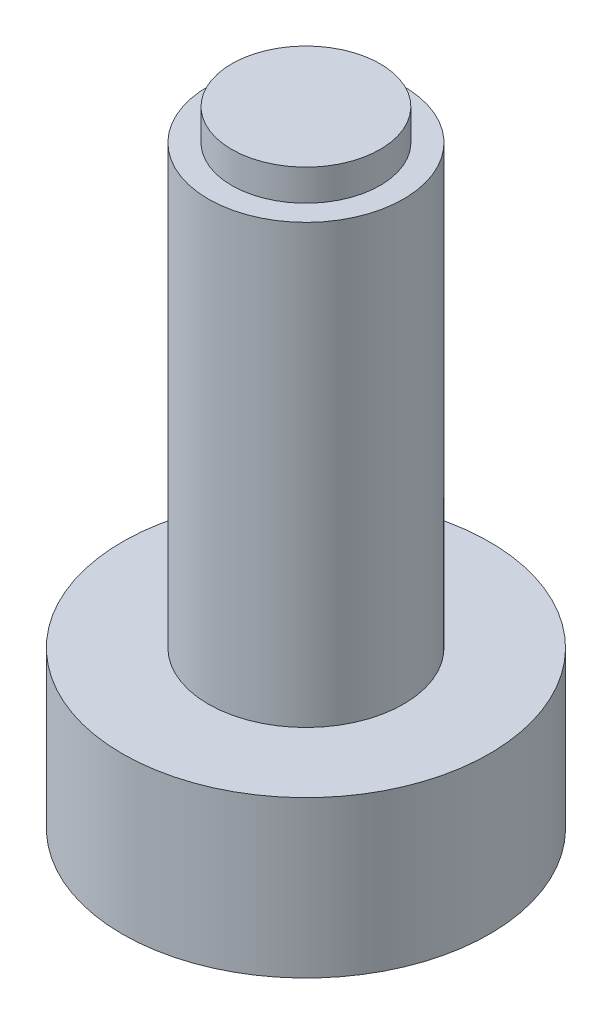
ISO-10303-21;
HEADER;
FILE_DESCRIPTION(('STEP AP214'),'2;1');
FILE_NAME('part.step','',(''),(''),'','','');
FILE_SCHEMA(('AUTOMOTIVE_DESIGN { 1 0 10303 214 1 1 1 1 }'));
ENDSEC;
DATA;
#1=APPLICATION_CONTEXT('core data for automotive mechanical design processes');
#2=APPLICATION_PROTOCOL_DEFINITION('international standard','automotive_design',2000,#1);
#3=PRODUCT_CONTEXT('',#1,'mechanical');
#4=PRODUCT('Part','Part','',(#3));
#5=PRODUCT_RELATED_PRODUCT_CATEGORY('part','',(#4));
#6=PRODUCT_DEFINITION_FORMATION('','',#4);
#7=PRODUCT_DEFINITION_CONTEXT('part definition',#1,'design');
#8=PRODUCT_DEFINITION('design','',#6,#7);
#9=PRODUCT_DEFINITION_SHAPE('','',#8);
#10=(LENGTH_UNIT() NAMED_UNIT(*) SI_UNIT(.MILLI.,.METRE.));
#11=(NAMED_UNIT(*) PLANE_ANGLE_UNIT() SI_UNIT($,.RADIAN.));
#12=(NAMED_UNIT(*) SI_UNIT($,.STERADIAN.) SOLID_ANGLE_UNIT());
#13=UNCERTAINTY_MEASURE_WITH_UNIT(LENGTH_MEASURE(1.E-05),#10,'distance_accuracy_value','');
#14=(GEOMETRIC_REPRESENTATION_CONTEXT(3) GLOBAL_UNCERTAINTY_ASSIGNED_CONTEXT((#13)) GLOBAL_UNIT_ASSIGNED_CONTEXT((#10,
#11,#12)) REPRESENTATION_CONTEXT('',''));
#15=CARTESIAN_POINT('',(0.,0.,0.));
#16=DIRECTION('',(0.,0.,1.));
#17=DIRECTION('',(1.,0.,0.));
#18=AXIS2_PLACEMENT_3D('',#15,#16,#17);
#19=CARTESIAN_POINT('',(0.,0.,0.));
#20=DIRECTION('',(0.,-1.,0.));
#21=DIRECTION('',(0.,0.,-1.));
#22=AXIS2_PLACEMENT_3D('',#19,#20,#21);
#23=CYLINDRICAL_SURFACE('',#22,4.7);
#24=CARTESIAN_POINT('',(0.,0.,0.));
#25=DIRECTION('',(0.,1.,0.));
#26=DIRECTION('',(0.,0.,1.));
#27=AXIS2_PLACEMENT_3D('',#24,#25,#26);
#28=CIRCLE('',#27,4.7);
#29=CARTESIAN_POINT('',(0.,0.,4.7));
#30=VERTEX_POINT('',#29);
#31=EDGE_CURVE('E153',#30,#30,#28,.T.);
#32=ORIENTED_EDGE('',*,*,#31,.F.);
#33=EDGE_LOOP('',(#32));
#34=FACE_BOUND('',#33,.T.);
#35=CARTESIAN_POINT('',(0.,-4.,0.));
#36=DIRECTION('',(0.,1.,0.));
#37=DIRECTION('',(0.,0.,1.));
#38=AXIS2_PLACEMENT_3D('',#35,#36,#37);
#39=CIRCLE('',#38,4.7);
#40=CARTESIAN_POINT('',(0.,-4.,4.7));
#41=VERTEX_POINT('',#40);
#42=EDGE_CURVE('E40',#41,#41,#39,.T.);
#43=ORIENTED_EDGE('',*,*,#42,.T.);
#44=EDGE_LOOP('',(#43));
#45=FACE_BOUND('',#44,.T.);
#46=ADVANCED_FACE('F37',(#34,#45),#23,.T.);
#47=CARTESIAN_POINT('',(0.,0.,0.));
#48=DIRECTION('',(0.,1.,0.));
#49=DIRECTION('',(0.,0.,1.));
#50=AXIS2_PLACEMENT_3D('',#47,#48,#49);
#51=PLANE('',#50);
#52=CARTESIAN_POINT('',(0.,0.,0.));
#53=DIRECTION('',(0.,1.,0.));
#54=DIRECTION('',(0.,0.,1.));
#55=AXIS2_PLACEMENT_3D('',#52,#53,#54);
#56=CIRCLE('',#55,2.5);
#57=CARTESIAN_POINT('',(0.,0.,2.5));
#58=VERTEX_POINT('',#57);
#59=EDGE_CURVE('E45',#58,#58,#56,.T.);
#60=ORIENTED_EDGE('',*,*,#59,.F.);
#61=EDGE_LOOP('',(#60));
#62=FACE_BOUND('',#61,.T.);
#63=ORIENTED_EDGE('',*,*,#31,.T.);
#64=EDGE_LOOP('',(#63));
#65=FACE_BOUND('',#64,.T.);
#66=ADVANCED_FACE('F162',(#62,#65),#51,.T.);
#67=CARTESIAN_POINT('',(0.,-4.,0.));
#68=DIRECTION('',(0.,1.,0.));
#69=DIRECTION('',(0.,0.,1.));
#70=AXIS2_PLACEMENT_3D('',#67,#68,#69);
#71=PLANE('',#70);
#72=DIRECTION('',(0.5,0.,-0.866025403784439));
#73=VECTOR('',#72,1.);
#74=CARTESIAN_POINT('',(1.73205080756888,-4.,0.));
#75=LINE('',#74,#73);
#76=CARTESIAN_POINT('',(0.866025403784439,-4.,1.5));
#77=VERTEX_POINT('',#76);
#78=CARTESIAN_POINT('',(1.73205080756888,-4.,0.));
#79=VERTEX_POINT('',#78);
#80=EDGE_CURVE('E115',#77,#79,#75,.T.);
#81=ORIENTED_EDGE('',*,*,#80,.T.);
#82=DIRECTION('',(-0.5,0.,-0.866025403784439));
#83=VECTOR('',#82,1.);
#84=CARTESIAN_POINT('',(0.866025403784439,-4.,-1.5));
#85=LINE('',#84,#83);
#86=CARTESIAN_POINT('',(0.866025403784439,-4.,-1.5));
#87=VERTEX_POINT('',#86);
#88=EDGE_CURVE('E139',#79,#87,#85,.T.);
#89=ORIENTED_EDGE('',*,*,#88,.T.);
#90=DIRECTION('',(-1.,0.,0.));
#91=VECTOR('',#90,1.);
#92=CARTESIAN_POINT('',(-0.866025403784439,-4.,-1.5));
#93=LINE('',#92,#91);
#94=CARTESIAN_POINT('',(-0.866025403784439,-4.,-1.5));
#95=VERTEX_POINT('',#94);
#96=EDGE_CURVE('E121',#87,#95,#93,.T.);
#97=ORIENTED_EDGE('',*,*,#96,.T.);
#98=DIRECTION('',(-0.5,0.,0.866025403784439));
#99=VECTOR('',#98,1.);
#100=CARTESIAN_POINT('',(-1.73205080756888,-4.,0.));
#101=LINE('',#100,#99);
#102=CARTESIAN_POINT('',(-1.73205080756888,-4.,0.));
#103=VERTEX_POINT('',#102);
#104=EDGE_CURVE('E53',#95,#103,#101,.T.);
#105=ORIENTED_EDGE('',*,*,#104,.T.);
#106=DIRECTION('',(0.5,0.,0.866025403784439));
#107=VECTOR('',#106,1.);
#108=CARTESIAN_POINT('',(-0.866025403784438,-4.,1.5));
#109=LINE('',#108,#107);
#110=CARTESIAN_POINT('',(-0.866025403784438,-4.,1.5));
#111=VERTEX_POINT('',#110);
#112=EDGE_CURVE('E101',#103,#111,#109,.T.);
#113=ORIENTED_EDGE('',*,*,#112,.T.);
#114=DIRECTION('',(1.,0.,0.));
#115=VECTOR('',#114,1.);
#116=CARTESIAN_POINT('',(0.866025403784439,-4.,1.5));
#117=LINE('',#116,#115);
#118=EDGE_CURVE('E111',#111,#77,#117,.T.);
#119=ORIENTED_EDGE('',*,*,#118,.T.);
#120=EDGE_LOOP('',(#81,#89,#97,#105,#113,#119));
#121=FACE_BOUND('',#120,.T.);
#122=ORIENTED_EDGE('',*,*,#42,.F.);
#123=EDGE_LOOP('',(#122));
#124=FACE_BOUND('',#123,.T.);
#125=ADVANCED_FACE('F117',(#121,#124),#71,.F.);
#126=CARTESIAN_POINT('',(0.,11.2,0.));
#127=DIRECTION('',(0.,-1.,0.));
#128=DIRECTION('',(0.,0.,-1.));
#129=AXIS2_PLACEMENT_3D('',#126,#127,#128);
#130=CYLINDRICAL_SURFACE('',#129,2.5);
#131=CARTESIAN_POINT('',(0.,11.2,0.));
#132=DIRECTION('',(0.,1.,0.));
#133=DIRECTION('',(0.,0.,1.));
#134=AXIS2_PLACEMENT_3D('',#131,#132,#133);
#135=CIRCLE('',#134,2.5);
#136=CARTESIAN_POINT('',(0.,11.2,2.5));
#137=VERTEX_POINT('',#136);
#138=EDGE_CURVE('E148',#137,#137,#135,.T.);
#139=ORIENTED_EDGE('',*,*,#138,.F.);
#140=EDGE_LOOP('',(#139));
#141=FACE_BOUND('',#140,.T.);
#142=ORIENTED_EDGE('',*,*,#59,.T.);
#143=EDGE_LOOP('',(#142));
#144=FACE_BOUND('',#143,.T.);
#145=ADVANCED_FACE('F161',(#141,#144),#130,.T.);
#146=CARTESIAN_POINT('',(0.,11.2,0.));
#147=DIRECTION('',(0.,1.,0.));
#148=DIRECTION('',(0.,0.,1.));
#149=AXIS2_PLACEMENT_3D('',#146,#147,#148);
#150=PLANE('',#149);
#151=CARTESIAN_POINT('',(0.,11.2,0.));
#152=DIRECTION('',(0.,1.,0.));
#153=DIRECTION('',(0.,0.,1.));
#154=AXIS2_PLACEMENT_3D('',#151,#152,#153);
#155=CIRCLE('',#154,1.9);
#156=CARTESIAN_POINT('',(0.,11.2,1.9));
#157=VERTEX_POINT('',#156);
#158=EDGE_CURVE('E11',#157,#157,#155,.T.);
#159=ORIENTED_EDGE('',*,*,#158,.F.);
#160=EDGE_LOOP('',(#159));
#161=FACE_BOUND('',#160,.T.);
#162=ORIENTED_EDGE('',*,*,#138,.T.);
#163=EDGE_LOOP('',(#162));
#164=FACE_BOUND('',#163,.T.);
#165=ADVANCED_FACE('F167',(#161,#164),#150,.T.);
#166=CARTESIAN_POINT('',(0.,12.,0.));
#167=DIRECTION('',(0.,-1.,0.));
#168=DIRECTION('',(0.,0.,-1.));
#169=AXIS2_PLACEMENT_3D('',#166,#167,#168);
#170=CYLINDRICAL_SURFACE('',#169,1.9);
#171=CARTESIAN_POINT('',(0.,12.,0.));
#172=DIRECTION('',(0.,1.,0.));
#173=DIRECTION('',(0.,0.,1.));
#174=AXIS2_PLACEMENT_3D('',#171,#172,#173);
#175=CIRCLE('',#174,1.9);
#176=CARTESIAN_POINT('',(0.,12.,1.9));
#177=VERTEX_POINT('',#176);
#178=EDGE_CURVE('E141',#177,#177,#175,.T.);
#179=ORIENTED_EDGE('',*,*,#178,.F.);
#180=EDGE_LOOP('',(#179));
#181=FACE_BOUND('',#180,.T.);
#182=ORIENTED_EDGE('',*,*,#158,.T.);
#183=EDGE_LOOP('',(#182));
#184=FACE_BOUND('',#183,.T.);
#185=ADVANCED_FACE('F198',(#181,#184),#170,.T.);
#186=CARTESIAN_POINT('',(0.,12.,0.));
#187=DIRECTION('',(0.,1.,0.));
#188=DIRECTION('',(0.,0.,1.));
#189=AXIS2_PLACEMENT_3D('',#186,#187,#188);
#190=PLANE('',#189);
#191=ORIENTED_EDGE('',*,*,#178,.T.);
#192=EDGE_LOOP('',(#191));
#193=FACE_BOUND('',#192,.T.);
#194=ADVANCED_FACE('F209',(#193),#190,.T.);
#195=CARTESIAN_POINT('',(0.866025403784439,-4.,-1.5));
#196=DIRECTION('',(0.866025403784439,0.,-0.5));
#197=DIRECTION('',(-0.5,0.,-0.866025403784439));
#198=AXIS2_PLACEMENT_3D('',#195,#196,#197);
#199=PLANE('',#198);
#200=DIRECTION('',(-0.5,0.,-0.866025403784439));
#201=VECTOR('',#200,1.);
#202=CARTESIAN_POINT('',(0.866025403784439,-1.5,-1.5));
#203=LINE('',#202,#201);
#204=CARTESIAN_POINT('',(1.73205080756888,-1.5,0.));
#205=VERTEX_POINT('',#204);
#206=CARTESIAN_POINT('',(0.866025403784439,-1.5,-1.5));
#207=VERTEX_POINT('',#206);
#208=EDGE_CURVE('E126',#205,#207,#203,.T.);
#209=ORIENTED_EDGE('',*,*,#208,.T.);
#210=DIRECTION('',(0.,1.,0.));
#211=VECTOR('',#210,1.);
#212=CARTESIAN_POINT('',(0.866025403784439,-4.,-1.5));
#213=LINE('',#212,#211);
#214=EDGE_CURVE('E90',#87,#207,#213,.T.);
#215=ORIENTED_EDGE('',*,*,#214,.F.);
#216=ORIENTED_EDGE('',*,*,#88,.F.);
#217=DIRECTION('',(0.,1.,0.));
#218=VECTOR('',#217,1.);
#219=CARTESIAN_POINT('',(1.73205080756888,-4.,0.));
#220=LINE('',#219,#218);
#221=EDGE_CURVE('E62',#79,#205,#220,.T.);
#222=ORIENTED_EDGE('',*,*,#221,.T.);
#223=EDGE_LOOP('',(#209,#215,#216,#222));
#224=FACE_BOUND('',#223,.T.);
#225=ADVANCED_FACE('F219',(#224),#199,.F.);
#226=CARTESIAN_POINT('',(1.73205080756888,-4.,0.));
#227=DIRECTION('',(0.866025403784439,0.,0.5));
#228=DIRECTION('',(0.5,0.,-0.866025403784439));
#229=AXIS2_PLACEMENT_3D('',#226,#227,#228);
#230=PLANE('',#229);
#231=DIRECTION('',(0.5,0.,-0.866025403784439));
#232=VECTOR('',#231,1.);
#233=CARTESIAN_POINT('',(1.73205080756888,-1.5,0.));
#234=LINE('',#233,#232);
#235=CARTESIAN_POINT('',(0.866025403784439,-1.5,1.5));
#236=VERTEX_POINT('',#235);
#237=EDGE_CURVE('E137',#236,#205,#234,.T.);
#238=ORIENTED_EDGE('',*,*,#237,.T.);
#239=ORIENTED_EDGE('',*,*,#221,.F.);
#240=ORIENTED_EDGE('',*,*,#80,.F.);
#241=DIRECTION('',(0.,1.,0.));
#242=VECTOR('',#241,1.);
#243=CARTESIAN_POINT('',(0.866025403784439,-4.,1.5));
#244=LINE('',#243,#242);
#245=EDGE_CURVE('E107',#77,#236,#244,.T.);
#246=ORIENTED_EDGE('',*,*,#245,.T.);
#247=EDGE_LOOP('',(#238,#239,#240,#246));
#248=FACE_BOUND('',#247,.T.);
#249=ADVANCED_FACE('F235',(#248),#230,.F.);
#250=CARTESIAN_POINT('',(0.866025403784439,-4.,1.5));
#251=DIRECTION('',(0.,0.,1.));
#252=DIRECTION('',(1.,0.,0.));
#253=AXIS2_PLACEMENT_3D('',#250,#251,#252);
#254=PLANE('',#253);
#255=DIRECTION('',(1.,0.,0.));
#256=VECTOR('',#255,1.);
#257=CARTESIAN_POINT('',(0.866025403784439,-1.5,1.5));
#258=LINE('',#257,#256);
#259=CARTESIAN_POINT('',(-0.866025403784438,-1.5,1.5));
#260=VERTEX_POINT('',#259);
#261=EDGE_CURVE('E135',#260,#236,#258,.T.);
#262=ORIENTED_EDGE('',*,*,#261,.T.);
#263=ORIENTED_EDGE('',*,*,#245,.F.);
#264=ORIENTED_EDGE('',*,*,#118,.F.);
#265=DIRECTION('',(0.,1.,0.));
#266=VECTOR('',#265,1.);
#267=CARTESIAN_POINT('',(-0.866025403784438,-4.,1.5));
#268=LINE('',#267,#266);
#269=EDGE_CURVE('E97',#111,#260,#268,.T.);
#270=ORIENTED_EDGE('',*,*,#269,.T.);
#271=EDGE_LOOP('',(#262,#263,#264,#270));
#272=FACE_BOUND('',#271,.T.);
#273=ADVANCED_FACE('F112',(#272),#254,.F.);
#274=CARTESIAN_POINT('',(-0.866025403784438,-4.,1.5));
#275=DIRECTION('',(-0.866025403784439,0.,0.5));
#276=DIRECTION('',(0.5,0.,0.866025403784439));
#277=AXIS2_PLACEMENT_3D('',#274,#275,#276);
#278=PLANE('',#277);
#279=DIRECTION('',(0.5,0.,0.866025403784439));
#280=VECTOR('',#279,1.);
#281=CARTESIAN_POINT('',(-0.866025403784438,-1.5,1.5));
#282=LINE('',#281,#280);
#283=CARTESIAN_POINT('',(-1.73205080756888,-1.5,0.));
#284=VERTEX_POINT('',#283);
#285=EDGE_CURVE('E103',#284,#260,#282,.T.);
#286=ORIENTED_EDGE('',*,*,#285,.T.);
#287=ORIENTED_EDGE('',*,*,#269,.F.);
#288=ORIENTED_EDGE('',*,*,#112,.F.);
#289=DIRECTION('',(0.,1.,0.));
#290=VECTOR('',#289,1.);
#291=CARTESIAN_POINT('',(-1.73205080756888,-4.,0.));
#292=LINE('',#291,#290);
#293=EDGE_CURVE('E108',#103,#284,#292,.T.);
#294=ORIENTED_EDGE('',*,*,#293,.T.);
#295=EDGE_LOOP('',(#286,#287,#288,#294));
#296=FACE_BOUND('',#295,.T.);
#297=ADVANCED_FACE('F99',(#296),#278,.F.);
#298=CARTESIAN_POINT('',(-1.73205080756888,-4.,0.));
#299=DIRECTION('',(-0.866025403784439,0.,-0.5));
#300=DIRECTION('',(-0.5,0.,0.866025403784439));
#301=AXIS2_PLACEMENT_3D('',#298,#299,#300);
#302=PLANE('',#301);
#303=DIRECTION('',(-0.5,0.,0.866025403784439));
#304=VECTOR('',#303,1.);
#305=CARTESIAN_POINT('',(-1.73205080756888,-1.5,0.));
#306=LINE('',#305,#304);
#307=CARTESIAN_POINT('',(-0.866025403784439,-1.5,-1.5));
#308=VERTEX_POINT('',#307);
#309=EDGE_CURVE('E131',#308,#284,#306,.T.);
#310=ORIENTED_EDGE('',*,*,#309,.T.);
#311=ORIENTED_EDGE('',*,*,#293,.F.);
#312=ORIENTED_EDGE('',*,*,#104,.F.);
#313=DIRECTION('',(0.,1.,0.));
#314=VECTOR('',#313,1.);
#315=CARTESIAN_POINT('',(-0.866025403784439,-4.,-1.5));
#316=LINE('',#315,#314);
#317=EDGE_CURVE('E144',#95,#308,#316,.T.);
#318=ORIENTED_EDGE('',*,*,#317,.T.);
#319=EDGE_LOOP('',(#310,#311,#312,#318));
#320=FACE_BOUND('',#319,.T.);
#321=ADVANCED_FACE('F263',(#320),#302,.F.);
#322=CARTESIAN_POINT('',(-0.866025403784439,-4.,-1.5));
#323=DIRECTION('',(0.,0.,-1.));
#324=DIRECTION('',(-1.,0.,0.));
#325=AXIS2_PLACEMENT_3D('',#322,#323,#324);
#326=PLANE('',#325);
#327=DIRECTION('',(-1.,0.,0.));
#328=VECTOR('',#327,1.);
#329=CARTESIAN_POINT('',(-0.866025403784439,-1.5,-1.5));
#330=LINE('',#329,#328);
#331=EDGE_CURVE('E128',#207,#308,#330,.T.);
#332=ORIENTED_EDGE('',*,*,#331,.T.);
#333=ORIENTED_EDGE('',*,*,#317,.F.);
#334=ORIENTED_EDGE('',*,*,#96,.F.);
#335=ORIENTED_EDGE('',*,*,#214,.T.);
#336=EDGE_LOOP('',(#332,#333,#334,#335));
#337=FACE_BOUND('',#336,.T.);
#338=ADVANCED_FACE('F273',(#337),#326,.F.);
#339=CARTESIAN_POINT('',(0.,-1.5,0.));
#340=DIRECTION('',(0.,-1.,0.));
#341=DIRECTION('',(0.,0.,-1.));
#342=AXIS2_PLACEMENT_3D('',#339,#340,#341);
#343=PLANE('',#342);
#344=ORIENTED_EDGE('',*,*,#208,.F.);
#345=ORIENTED_EDGE('',*,*,#237,.F.);
#346=ORIENTED_EDGE('',*,*,#261,.F.);
#347=ORIENTED_EDGE('',*,*,#285,.F.);
#348=ORIENTED_EDGE('',*,*,#309,.F.);
#349=ORIENTED_EDGE('',*,*,#331,.F.);
#350=EDGE_LOOP('',(#344,#345,#346,#347,#348,#349));
#351=FACE_BOUND('',#350,.T.);
#352=ADVANCED_FACE('F283',(#351),#343,.T.);
#353=CLOSED_SHELL('',(#46,#66,#125,#145,#165,#185,#194,#225,#249,#273,#297,#321,#338,#352));
#354=MANIFOLD_SOLID_BREP('B2',#353);
#355=ADVANCED_BREP_SHAPE_REPRESENTATION('',(#18,#354),#14);
#356=SHAPE_DEFINITION_REPRESENTATION(#9,#355);
ENDSEC;
END-ISO-10303-21;
